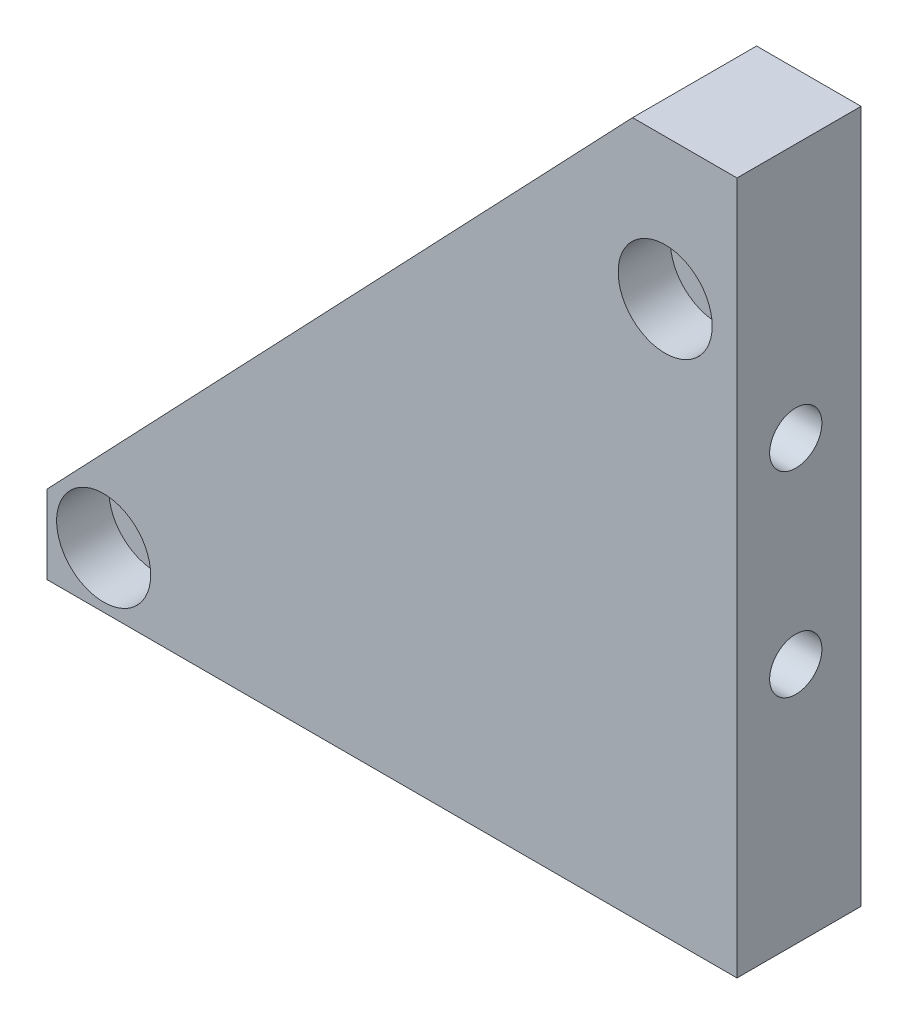
ISO-10303-21;
HEADER;
FILE_DESCRIPTION(('STEP AP214'),'2;1');
FILE_NAME('part.step','',(''),(''),'','','');
FILE_SCHEMA(('AUTOMOTIVE_DESIGN { 1 0 10303 214 1 1 1 1 }'));
ENDSEC;
DATA;
#1=APPLICATION_CONTEXT('core data for automotive mechanical design processes');
#2=APPLICATION_PROTOCOL_DEFINITION('international standard','automotive_design',2000,#1);
#3=PRODUCT_CONTEXT('',#1,'mechanical');
#4=PRODUCT('Part','Part','',(#3));
#5=PRODUCT_RELATED_PRODUCT_CATEGORY('part','',(#4));
#6=PRODUCT_DEFINITION_FORMATION('','',#4);
#7=PRODUCT_DEFINITION_CONTEXT('part definition',#1,'design');
#8=PRODUCT_DEFINITION('design','',#6,#7);
#9=PRODUCT_DEFINITION_SHAPE('','',#8);
#10=(LENGTH_UNIT() NAMED_UNIT(*) SI_UNIT(.MILLI.,.METRE.));
#11=(NAMED_UNIT(*) PLANE_ANGLE_UNIT() SI_UNIT($,.RADIAN.));
#12=(NAMED_UNIT(*) SI_UNIT($,.STERADIAN.) SOLID_ANGLE_UNIT());
#13=UNCERTAINTY_MEASURE_WITH_UNIT(LENGTH_MEASURE(1.E-05),#10,'distance_accuracy_value','');
#14=(GEOMETRIC_REPRESENTATION_CONTEXT(3) GLOBAL_UNCERTAINTY_ASSIGNED_CONTEXT((#13)) GLOBAL_UNIT_ASSIGNED_CONTEXT((#10,
#11,#12)) REPRESENTATION_CONTEXT('',''));
#15=CARTESIAN_POINT('',(0.,0.,0.));
#16=DIRECTION('',(0.,0.,1.));
#17=DIRECTION('',(1.,0.,0.));
#18=AXIS2_PLACEMENT_3D('',#15,#16,#17);
#19=CARTESIAN_POINT('',(-9.62274154761278,-10.8845921631138,9.5));
#20=DIRECTION('',(0.,0.,-1.));
#21=DIRECTION('',(-1.,0.,0.));
#22=AXIS2_PLACEMENT_3D('',#19,#20,#21);
#23=CYLINDRICAL_SURFACE('',#22,2.);
#24=CARTESIAN_POINT('',(-9.62274154761278,-10.8845921631138,0.));
#25=DIRECTION('',(0.,0.,1.));
#26=DIRECTION('',(1.,0.,0.));
#27=AXIS2_PLACEMENT_3D('',#24,#25,#26);
#28=CIRCLE('',#27,2.);
#29=CARTESIAN_POINT('',(-7.62274154761278,-10.8845921631138,0.));
#30=VERTEX_POINT('',#29);
#31=EDGE_CURVE('E147',#30,#30,#28,.T.);
#32=ORIENTED_EDGE('',*,*,#31,.F.);
#33=EDGE_LOOP('',(#32));
#34=FACE_BOUND('',#33,.T.);
#35=CARTESIAN_POINT('',(-9.62274154761278,-10.8845921631138,5.5));
#36=DIRECTION('',(0.,0.,1.));
#37=DIRECTION('',(1.,0.,0.));
#38=AXIS2_PLACEMENT_3D('',#35,#36,#37);
#39=CIRCLE('',#38,2.);
#40=CARTESIAN_POINT('',(-7.62274154761278,-10.8845921631138,5.5));
#41=VERTEX_POINT('',#40);
#42=EDGE_CURVE('E37',#41,#41,#39,.T.);
#43=ORIENTED_EDGE('',*,*,#42,.T.);
#44=EDGE_LOOP('',(#43));
#45=FACE_BOUND('',#44,.T.);
#46=ADVANCED_FACE('F33',(#34,#45),#23,.F.);
#47=CARTESIAN_POINT('',(-52.6227415476128,-48.8845921631138,9.5));
#48=DIRECTION('',(0.,0.,-1.));
#49=DIRECTION('',(-1.,0.,0.));
#50=AXIS2_PLACEMENT_3D('',#47,#48,#49);
#51=CYLINDRICAL_SURFACE('',#50,2.);
#52=CARTESIAN_POINT('',(-52.6227415476128,-48.8845921631138,0.));
#53=DIRECTION('',(0.,0.,1.));
#54=DIRECTION('',(1.,0.,0.));
#55=AXIS2_PLACEMENT_3D('',#52,#53,#54);
#56=CIRCLE('',#55,2.);
#57=CARTESIAN_POINT('',(-50.6227415476128,-48.8845921631138,0.));
#58=VERTEX_POINT('',#57);
#59=EDGE_CURVE('E115',#58,#58,#56,.T.);
#60=ORIENTED_EDGE('',*,*,#59,.F.);
#61=EDGE_LOOP('',(#60));
#62=FACE_BOUND('',#61,.T.);
#63=CARTESIAN_POINT('',(-52.6227415476128,-48.8845921631138,5.5));
#64=DIRECTION('',(0.,0.,1.));
#65=DIRECTION('',(1.,0.,0.));
#66=AXIS2_PLACEMENT_3D('',#63,#64,#65);
#67=CIRCLE('',#66,2.);
#68=CARTESIAN_POINT('',(-50.6227415476128,-48.8845921631138,5.5));
#69=VERTEX_POINT('',#68);
#70=EDGE_CURVE('E124',#69,#69,#67,.T.);
#71=ORIENTED_EDGE('',*,*,#70,.T.);
#72=EDGE_LOOP('',(#71));
#73=FACE_BOUND('',#72,.T.);
#74=ADVANCED_FACE('F177',(#62,#73),#51,.F.);
#75=CARTESIAN_POINT('',(0.,0.,9.5));
#76=DIRECTION('',(0.,0.,1.));
#77=DIRECTION('',(1.,0.,0.));
#78=AXIS2_PLACEMENT_3D('',#75,#76,#77);
#79=PLANE('',#78);
#80=CARTESIAN_POINT('',(-9.62274154761275,-10.8845921631138,9.5));
#81=DIRECTION('',(0.,0.,1.));
#82=DIRECTION('',(1.,0.,0.));
#83=AXIS2_PLACEMENT_3D('',#80,#81,#82);
#84=CIRCLE('',#83,3.6);
#85=CARTESIAN_POINT('',(-6.02274154761275,-10.8845921631138,9.5));
#86=VERTEX_POINT('',#85);
#87=EDGE_CURVE('E141',#86,#86,#84,.T.);
#88=ORIENTED_EDGE('',*,*,#87,.F.);
#89=EDGE_LOOP('',(#88));
#90=FACE_BOUND('',#89,.T.);
#91=CARTESIAN_POINT('',(-52.6227415476127,-48.8845921631138,9.5));
#92=DIRECTION('',(0.,0.,1.));
#93=DIRECTION('',(1.,0.,0.));
#94=AXIS2_PLACEMENT_3D('',#91,#92,#93);
#95=CIRCLE('',#94,3.6);
#96=CARTESIAN_POINT('',(-49.0227415476127,-48.8845921631138,9.5));
#97=VERTEX_POINT('',#96);
#98=EDGE_CURVE('E134',#97,#97,#95,.T.);
#99=ORIENTED_EDGE('',*,*,#98,.F.);
#100=EDGE_LOOP('',(#99));
#101=FACE_BOUND('',#100,.T.);
#102=DIRECTION('',(0.,1.,0.));
#103=VECTOR('',#102,1.);
#104=CARTESIAN_POINT('',(-4.12274154761276,-53.1603576627829,9.5));
#105=LINE('',#104,#103);
#106=CARTESIAN_POINT('',(-4.12274154761276,-53.1603576627829,9.5));
#107=VERTEX_POINT('',#106);
#108=CARTESIAN_POINT('',(-4.12274154761276,-0.104764568319671,9.5));
#109=VERTEX_POINT('',#108);
#110=EDGE_CURVE('E121',#107,#109,#105,.T.);
#111=ORIENTED_EDGE('',*,*,#110,.T.);
#112=DIRECTION('',(-1.,0.,0.));
#113=VECTOR('',#112,1.);
#114=CARTESIAN_POINT('',(-4.12274154761276,-0.104764568319671,9.5));
#115=LINE('',#114,#113);
#116=CARTESIAN_POINT('',(-12.1227415476128,-0.10476456831967,9.5));
#117=VERTEX_POINT('',#116);
#118=EDGE_CURVE('E84',#109,#117,#115,.T.);
#119=ORIENTED_EDGE('',*,*,#118,.T.);
#120=DIRECTION('',(-0.689871123978245,-0.72393220145328,0.));
#121=VECTOR('',#120,1.);
#122=CARTESIAN_POINT('',(-12.1227415476128,-0.10476456831967,9.5));
#123=LINE('',#122,#121);
#124=CARTESIAN_POINT('',(-56.9643646061987,-47.1603576627829,9.5));
#125=VERTEX_POINT('',#124);
#126=EDGE_CURVE('E88',#117,#125,#123,.T.);
#127=ORIENTED_EDGE('',*,*,#126,.T.);
#128=DIRECTION('',(0.,-1.,0.));
#129=VECTOR('',#128,1.);
#130=CARTESIAN_POINT('',(-56.9643646061987,-47.1603576627829,9.5));
#131=LINE('',#130,#129);
#132=CARTESIAN_POINT('',(-56.9643646061987,-53.1603576627829,9.5));
#133=VERTEX_POINT('',#132);
#134=EDGE_CURVE('E92',#125,#133,#131,.T.);
#135=ORIENTED_EDGE('',*,*,#134,.T.);
#136=DIRECTION('',(1.,0.,0.));
#137=VECTOR('',#136,1.);
#138=CARTESIAN_POINT('',(-56.9643646061987,-53.1603576627829,9.5));
#139=LINE('',#138,#137);
#140=EDGE_CURVE('E52',#133,#107,#139,.T.);
#141=ORIENTED_EDGE('',*,*,#140,.T.);
#142=EDGE_LOOP('',(#111,#119,#127,#135,#141));
#143=FACE_BOUND('',#142,.T.);
#144=ADVANCED_FACE('F90',(#90,#101,#143),#79,.T.);
#145=CARTESIAN_POINT('',(0.,0.,0.));
#146=DIRECTION('',(0.,0.,1.));
#147=DIRECTION('',(1.,0.,0.));
#148=AXIS2_PLACEMENT_3D('',#145,#146,#147);
#149=PLANE('',#148);
#150=DIRECTION('',(0.,1.,0.));
#151=VECTOR('',#150,1.);
#152=CARTESIAN_POINT('',(-4.12274154761276,-53.1603576627829,0.));
#153=LINE('',#152,#151);
#154=CARTESIAN_POINT('',(-4.12274154761276,-53.1603576627829,0.));
#155=VERTEX_POINT('',#154);
#156=CARTESIAN_POINT('',(-4.12274154761276,-0.104764568319671,0.));
#157=VERTEX_POINT('',#156);
#158=EDGE_CURVE('E111',#155,#157,#153,.T.);
#159=ORIENTED_EDGE('',*,*,#158,.F.);
#160=DIRECTION('',(1.,0.,0.));
#161=VECTOR('',#160,1.);
#162=CARTESIAN_POINT('',(-10.1227415476128,-53.1603576627829,0.));
#163=LINE('',#162,#161);
#164=CARTESIAN_POINT('',(-56.9643646061987,-53.1603576627829,0.));
#165=VERTEX_POINT('',#164);
#166=EDGE_CURVE('E72',#165,#155,#163,.T.);
#167=ORIENTED_EDGE('',*,*,#166,.F.);
#168=DIRECTION('',(0.,-1.,0.));
#169=VECTOR('',#168,1.);
#170=CARTESIAN_POINT('',(-56.9643646061987,-47.1603576627829,0.));
#171=LINE('',#170,#169);
#172=CARTESIAN_POINT('',(-56.9643646061987,-47.1603576627829,0.));
#173=VERTEX_POINT('',#172);
#174=EDGE_CURVE('E118',#173,#165,#171,.T.);
#175=ORIENTED_EDGE('',*,*,#174,.F.);
#176=DIRECTION('',(-0.689871123978245,-0.72393220145328,0.));
#177=VECTOR('',#176,1.);
#178=CARTESIAN_POINT('',(-12.1227415476128,-0.10476456831967,0.));
#179=LINE('',#178,#177);
#180=CARTESIAN_POINT('',(-12.1227415476128,-0.10476456831967,0.));
#181=VERTEX_POINT('',#180);
#182=EDGE_CURVE('E101',#181,#173,#179,.T.);
#183=ORIENTED_EDGE('',*,*,#182,.F.);
#184=DIRECTION('',(-1.,0.,0.));
#185=VECTOR('',#184,1.);
#186=CARTESIAN_POINT('',(-4.12274154761276,-0.104764568319671,0.));
#187=LINE('',#186,#185);
#188=EDGE_CURVE('E114',#157,#181,#187,.T.);
#189=ORIENTED_EDGE('',*,*,#188,.F.);
#190=EDGE_LOOP('',(#159,#167,#175,#183,#189));
#191=FACE_BOUND('',#190,.T.);
#192=ORIENTED_EDGE('',*,*,#59,.T.);
#193=EDGE_LOOP('',(#192));
#194=FACE_BOUND('',#193,.T.);
#195=ORIENTED_EDGE('',*,*,#31,.T.);
#196=EDGE_LOOP('',(#195));
#197=FACE_BOUND('',#196,.T.);
#198=ADVANCED_FACE('F161',(#191,#194,#197),#149,.F.);
#199=CARTESIAN_POINT('',(-4.12274154761276,-53.1603576627829,9.5));
#200=DIRECTION('',(-1.,0.,0.));
#201=DIRECTION('',(0.,0.,1.));
#202=AXIS2_PLACEMENT_3D('',#199,#200,#201);
#203=PLANE('',#202);
#204=CARTESIAN_POINT('',(-4.12274154761276,-19.6009932141937,5.0000000000002));
#205=DIRECTION('',(1.,0.,0.));
#206=DIRECTION('',(0.,0.,-1.));
#207=AXIS2_PLACEMENT_3D('',#204,#205,#206);
#208=CIRCLE('',#207,2.);
#209=CARTESIAN_POINT('',(-4.12274154761276,-19.6009932141937,3.0000000000002));
#210=VERTEX_POINT('',#209);
#211=EDGE_CURVE('E148',#210,#210,#208,.T.);
#212=ORIENTED_EDGE('',*,*,#211,.F.);
#213=EDGE_LOOP('',(#212));
#214=FACE_BOUND('',#213,.T.);
#215=CARTESIAN_POINT('',(-4.12274154761276,-34.6009932141937,5.0000000000001));
#216=DIRECTION('',(1.,0.,0.));
#217=DIRECTION('',(0.,0.,-1.));
#218=AXIS2_PLACEMENT_3D('',#215,#216,#217);
#219=CIRCLE('',#218,2.);
#220=CARTESIAN_POINT('',(-4.12274154761276,-34.6009932141937,3.00000000000009));
#221=VERTEX_POINT('',#220);
#222=EDGE_CURVE('E126',#221,#221,#219,.T.);
#223=ORIENTED_EDGE('',*,*,#222,.F.);
#224=EDGE_LOOP('',(#223));
#225=FACE_BOUND('',#224,.T.);
#226=ORIENTED_EDGE('',*,*,#158,.T.);
#227=DIRECTION('',(0.,0.,-1.));
#228=VECTOR('',#227,1.);
#229=CARTESIAN_POINT('',(-4.12274154761276,-0.104764568319671,9.5));
#230=LINE('',#229,#228);
#231=EDGE_CURVE('E11',#109,#157,#230,.T.);
#232=ORIENTED_EDGE('',*,*,#231,.F.);
#233=ORIENTED_EDGE('',*,*,#110,.F.);
#234=DIRECTION('',(0.,0.,-1.));
#235=VECTOR('',#234,1.);
#236=CARTESIAN_POINT('',(-4.12274154761276,-53.1603576627829,9.5));
#237=LINE('',#236,#235);
#238=EDGE_CURVE('E107',#107,#155,#237,.T.);
#239=ORIENTED_EDGE('',*,*,#238,.T.);
#240=EDGE_LOOP('',(#226,#232,#233,#239));
#241=FACE_BOUND('',#240,.T.);
#242=ADVANCED_FACE('F35',(#214,#225,#241),#203,.F.);
#243=CARTESIAN_POINT('',(-4.12274154761276,-0.104764568319671,9.5));
#244=DIRECTION('',(0.,-1.,0.));
#245=DIRECTION('',(1.,0.,0.));
#246=AXIS2_PLACEMENT_3D('',#243,#244,#245);
#247=PLANE('',#246);
#248=ORIENTED_EDGE('',*,*,#188,.T.);
#249=DIRECTION('',(0.,0.,-1.));
#250=VECTOR('',#249,1.);
#251=CARTESIAN_POINT('',(-12.1227415476128,-0.10476456831967,9.5));
#252=LINE('',#251,#250);
#253=EDGE_CURVE('E43',#117,#181,#252,.T.);
#254=ORIENTED_EDGE('',*,*,#253,.F.);
#255=ORIENTED_EDGE('',*,*,#118,.F.);
#256=ORIENTED_EDGE('',*,*,#231,.T.);
#257=EDGE_LOOP('',(#248,#254,#255,#256));
#258=FACE_BOUND('',#257,.T.);
#259=ADVANCED_FACE('F160',(#258),#247,.F.);
#260=CARTESIAN_POINT('',(-12.1227415476128,-0.10476456831967,9.5));
#261=DIRECTION('',(0.72393220145328,-0.689871123978245,0.));
#262=DIRECTION('',(0.689871123978245,0.72393220145328,0.));
#263=AXIS2_PLACEMENT_3D('',#260,#261,#262);
#264=PLANE('',#263);
#265=ORIENTED_EDGE('',*,*,#182,.T.);
#266=DIRECTION('',(0.,0.,-1.));
#267=VECTOR('',#266,1.);
#268=CARTESIAN_POINT('',(-56.9643646061987,-47.1603576627829,9.5));
#269=LINE('',#268,#267);
#270=EDGE_CURVE('E98',#125,#173,#269,.T.);
#271=ORIENTED_EDGE('',*,*,#270,.F.);
#272=ORIENTED_EDGE('',*,*,#126,.F.);
#273=ORIENTED_EDGE('',*,*,#253,.T.);
#274=EDGE_LOOP('',(#265,#271,#272,#273));
#275=FACE_BOUND('',#274,.T.);
#276=ADVANCED_FACE('F99',(#275),#264,.F.);
#277=CARTESIAN_POINT('',(-56.9643646061987,-47.1603576627829,9.5));
#278=DIRECTION('',(1.,0.,0.));
#279=DIRECTION('',(0.,0.,-1.));
#280=AXIS2_PLACEMENT_3D('',#277,#278,#279);
#281=PLANE('',#280);
#282=ORIENTED_EDGE('',*,*,#174,.T.);
#283=DIRECTION('',(0.,0.,-1.));
#284=VECTOR('',#283,1.);
#285=CARTESIAN_POINT('',(-56.9643646061987,-53.1603576627829,9.5));
#286=LINE('',#285,#284);
#287=EDGE_CURVE('E103',#133,#165,#286,.T.);
#288=ORIENTED_EDGE('',*,*,#287,.F.);
#289=ORIENTED_EDGE('',*,*,#134,.F.);
#290=ORIENTED_EDGE('',*,*,#270,.T.);
#291=EDGE_LOOP('',(#282,#288,#289,#290));
#292=FACE_BOUND('',#291,.T.);
#293=ADVANCED_FACE('F105',(#292),#281,.F.);
#294=CARTESIAN_POINT('',(-10.1227415476128,-53.1603576627829,9.5));
#295=DIRECTION('',(0.,1.,0.));
#296=DIRECTION('',(0.,0.,1.));
#297=AXIS2_PLACEMENT_3D('',#294,#295,#296);
#298=PLANE('',#297);
#299=ORIENTED_EDGE('',*,*,#166,.T.);
#300=ORIENTED_EDGE('',*,*,#238,.F.);
#301=ORIENTED_EDGE('',*,*,#140,.F.);
#302=ORIENTED_EDGE('',*,*,#287,.T.);
#303=EDGE_LOOP('',(#299,#300,#301,#302));
#304=FACE_BOUND('',#303,.T.);
#305=ADVANCED_FACE('F163',(#304),#298,.F.);
#306=CARTESIAN_POINT('',(-16.1227415476128,-34.6009932141937,5.0000000000001));
#307=DIRECTION('',(1.,0.,0.));
#308=DIRECTION('',(0.,0.,-1.));
#309=AXIS2_PLACEMENT_3D('',#306,#307,#308);
#310=CYLINDRICAL_SURFACE('',#309,2.);
#311=CARTESIAN_POINT('',(-16.1227415476128,-34.6009932141937,5.0000000000001));
#312=DIRECTION('',(1.,0.,0.));
#313=DIRECTION('',(0.,0.,-1.));
#314=AXIS2_PLACEMENT_3D('',#311,#312,#313);
#315=CIRCLE('',#314,2.);
#316=CARTESIAN_POINT('',(-16.1227415476128,-34.6009932141937,3.00000000000009));
#317=VERTEX_POINT('',#316);
#318=EDGE_CURVE('E131',#317,#317,#315,.T.);
#319=ORIENTED_EDGE('',*,*,#318,.F.);
#320=EDGE_LOOP('',(#319));
#321=FACE_BOUND('',#320,.T.);
#322=ORIENTED_EDGE('',*,*,#222,.T.);
#323=EDGE_LOOP('',(#322));
#324=FACE_BOUND('',#323,.T.);
#325=ADVANCED_FACE('F165',(#321,#324),#310,.F.);
#326=CARTESIAN_POINT('',(-16.1227415476128,-34.6009932141937,5.0000000000001));
#327=DIRECTION('',(1.,0.,0.));
#328=DIRECTION('',(0.,0.,-1.));
#329=AXIS2_PLACEMENT_3D('',#326,#327,#328);
#330=PLANE('',#329);
#331=ORIENTED_EDGE('',*,*,#318,.T.);
#332=EDGE_LOOP('',(#331));
#333=FACE_BOUND('',#332,.T.);
#334=ADVANCED_FACE('F171',(#333),#330,.T.);
#335=CARTESIAN_POINT('',(-16.1227415476128,-19.6009932141937,5.0000000000002));
#336=DIRECTION('',(1.,0.,0.));
#337=DIRECTION('',(0.,0.,-1.));
#338=AXIS2_PLACEMENT_3D('',#335,#336,#337);
#339=CYLINDRICAL_SURFACE('',#338,2.);
#340=CARTESIAN_POINT('',(-16.1227415476128,-19.6009932141937,5.0000000000002));
#341=DIRECTION('',(1.,0.,0.));
#342=DIRECTION('',(0.,0.,-1.));
#343=AXIS2_PLACEMENT_3D('',#340,#341,#342);
#344=CIRCLE('',#343,2.);
#345=CARTESIAN_POINT('',(-16.1227415476128,-19.6009932141937,3.0000000000002));
#346=VERTEX_POINT('',#345);
#347=EDGE_CURVE('E144',#346,#346,#344,.T.);
#348=ORIENTED_EDGE('',*,*,#347,.F.);
#349=EDGE_LOOP('',(#348));
#350=FACE_BOUND('',#349,.T.);
#351=ORIENTED_EDGE('',*,*,#211,.T.);
#352=EDGE_LOOP('',(#351));
#353=FACE_BOUND('',#352,.T.);
#354=ADVANCED_FACE('F204',(#350,#353),#339,.F.);
#355=CARTESIAN_POINT('',(-16.1227415476128,-19.6009932141937,5.0000000000002));
#356=DIRECTION('',(1.,0.,0.));
#357=DIRECTION('',(0.,0.,-1.));
#358=AXIS2_PLACEMENT_3D('',#355,#356,#357);
#359=PLANE('',#358);
#360=ORIENTED_EDGE('',*,*,#347,.T.);
#361=EDGE_LOOP('',(#360));
#362=FACE_BOUND('',#361,.T.);
#363=ADVANCED_FACE('F206',(#362),#359,.T.);
#364=CARTESIAN_POINT('',(-52.6227415476127,-48.8845921631138,5.5));
#365=DIRECTION('',(0.,0.,1.));
#366=DIRECTION('',(1.,0.,0.));
#367=AXIS2_PLACEMENT_3D('',#364,#365,#366);
#368=CYLINDRICAL_SURFACE('',#367,3.6);
#369=CARTESIAN_POINT('',(-52.6227415476127,-48.8845921631138,5.5));
#370=DIRECTION('',(0.,0.,1.));
#371=DIRECTION('',(1.,0.,0.));
#372=AXIS2_PLACEMENT_3D('',#369,#370,#371);
#373=CIRCLE('',#372,3.6);
#374=CARTESIAN_POINT('',(-49.0227415476127,-48.8845921631138,5.5));
#375=VERTEX_POINT('',#374);
#376=EDGE_CURVE('E127',#375,#375,#373,.T.);
#377=ORIENTED_EDGE('',*,*,#376,.F.);
#378=EDGE_LOOP('',(#377));
#379=FACE_BOUND('',#378,.T.);
#380=ORIENTED_EDGE('',*,*,#98,.T.);
#381=EDGE_LOOP('',(#380));
#382=FACE_BOUND('',#381,.T.);
#383=ADVANCED_FACE('F213',(#379,#382),#368,.F.);
#384=CARTESIAN_POINT('',(-52.6227415476127,-48.8845921631138,5.5));
#385=DIRECTION('',(0.,0.,1.));
#386=DIRECTION('',(1.,0.,0.));
#387=AXIS2_PLACEMENT_3D('',#384,#385,#386);
#388=PLANE('',#387);
#389=ORIENTED_EDGE('',*,*,#70,.F.);
#390=EDGE_LOOP('',(#389));
#391=FACE_BOUND('',#390,.T.);
#392=ORIENTED_EDGE('',*,*,#376,.T.);
#393=EDGE_LOOP('',(#392));
#394=FACE_BOUND('',#393,.T.);
#395=ADVANCED_FACE('F221',(#391,#394),#388,.T.);
#396=CARTESIAN_POINT('',(-9.62274154761275,-10.8845921631138,5.5));
#397=DIRECTION('',(0.,0.,1.));
#398=DIRECTION('',(1.,0.,0.));
#399=AXIS2_PLACEMENT_3D('',#396,#397,#398);
#400=CYLINDRICAL_SURFACE('',#399,3.6);
#401=CARTESIAN_POINT('',(-9.62274154761275,-10.8845921631138,5.5));
#402=DIRECTION('',(0.,0.,1.));
#403=DIRECTION('',(1.,0.,0.));
#404=AXIS2_PLACEMENT_3D('',#401,#402,#403);
#405=CIRCLE('',#404,3.6);
#406=CARTESIAN_POINT('',(-6.02274154761275,-10.8845921631138,5.5));
#407=VERTEX_POINT('',#406);
#408=EDGE_CURVE('E240',#407,#407,#405,.T.);
#409=ORIENTED_EDGE('',*,*,#408,.F.);
#410=EDGE_LOOP('',(#409));
#411=FACE_BOUND('',#410,.T.);
#412=ORIENTED_EDGE('',*,*,#87,.T.);
#413=EDGE_LOOP('',(#412));
#414=FACE_BOUND('',#413,.T.);
#415=ADVANCED_FACE('F225',(#411,#414),#400,.F.);
#416=CARTESIAN_POINT('',(-9.62274154761275,-10.8845921631138,5.5));
#417=DIRECTION('',(0.,0.,1.));
#418=DIRECTION('',(1.,0.,0.));
#419=AXIS2_PLACEMENT_3D('',#416,#417,#418);
#420=PLANE('',#419);
#421=ORIENTED_EDGE('',*,*,#42,.F.);
#422=EDGE_LOOP('',(#421));
#423=FACE_BOUND('',#422,.T.);
#424=ORIENTED_EDGE('',*,*,#408,.T.);
#425=EDGE_LOOP('',(#424));
#426=FACE_BOUND('',#425,.T.);
#427=ADVANCED_FACE('F229',(#423,#426),#420,.T.);
#428=CLOSED_SHELL('',(#46,#74,#144,#198,#242,#259,#276,#293,#305,#325,#334,#354,#363,#383,#395,
#415,#427));
#429=MANIFOLD_SOLID_BREP('B2',#428);
#430=ADVANCED_BREP_SHAPE_REPRESENTATION('',(#18,#429),#14);
#431=SHAPE_DEFINITION_REPRESENTATION(#9,#430);
ENDSEC;
END-ISO-10303-21;
